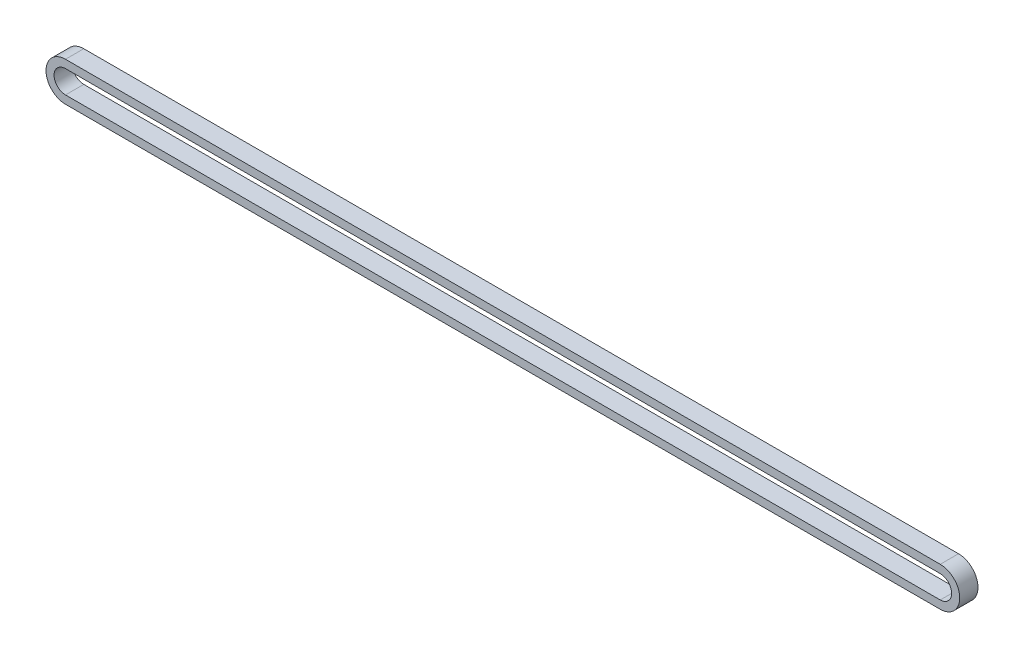
ISO-10303-21;
HEADER;
FILE_DESCRIPTION(('STEP AP214'),'2;1');
FILE_NAME('part.step','',(''),(''),'','','');
FILE_SCHEMA(('AUTOMOTIVE_DESIGN { 1 0 10303 214 1 1 1 1 }'));
ENDSEC;
DATA;
#1=APPLICATION_CONTEXT('core data for automotive mechanical design processes');
#2=APPLICATION_PROTOCOL_DEFINITION('international standard','automotive_design',2000,#1);
#3=PRODUCT_CONTEXT('',#1,'mechanical');
#4=PRODUCT('Part','Part','',(#3));
#5=PRODUCT_RELATED_PRODUCT_CATEGORY('part','',(#4));
#6=PRODUCT_DEFINITION_FORMATION('','',#4);
#7=PRODUCT_DEFINITION_CONTEXT('part definition',#1,'design');
#8=PRODUCT_DEFINITION('design','',#6,#7);
#9=PRODUCT_DEFINITION_SHAPE('','',#8);
#10=(LENGTH_UNIT() NAMED_UNIT(*) SI_UNIT(.MILLI.,.METRE.));
#11=(NAMED_UNIT(*) PLANE_ANGLE_UNIT() SI_UNIT($,.RADIAN.));
#12=(NAMED_UNIT(*) SI_UNIT($,.STERADIAN.) SOLID_ANGLE_UNIT());
#13=UNCERTAINTY_MEASURE_WITH_UNIT(LENGTH_MEASURE(1.E-05),#10,'distance_accuracy_value','');
#14=(GEOMETRIC_REPRESENTATION_CONTEXT(3) GLOBAL_UNCERTAINTY_ASSIGNED_CONTEXT((#13)) GLOBAL_UNIT_ASSIGNED_CONTEXT((#10,
#11,#12)) REPRESENTATION_CONTEXT('',''));
#15=CARTESIAN_POINT('',(0.,0.,0.));
#16=DIRECTION('',(0.,0.,1.));
#17=DIRECTION('',(1.,0.,0.));
#18=AXIS2_PLACEMENT_3D('',#15,#16,#17);
#19=CARTESIAN_POINT('',(0.,1.96023752785379E-13,3.));
#20=DIRECTION('',(0.,0.,1.));
#21=DIRECTION('',(1.,0.,0.));
#22=AXIS2_PLACEMENT_3D('',#19,#20,#21);
#23=PLANE('',#22);
#24=CARTESIAN_POINT('',(0.,1.96023752785379E-13,3.));
#25=DIRECTION('',(0.,0.,1.));
#26=DIRECTION('',(1.,0.,0.));
#27=AXIS2_PLACEMENT_3D('',#24,#25,#26);
#28=CIRCLE('',#27,3.2);
#29=CARTESIAN_POINT('',(0.,3.2000000000002,3.));
#30=VERTEX_POINT('',#29);
#31=CARTESIAN_POINT('',(0.,-3.1999999999998,3.));
#32=VERTEX_POINT('',#31);
#33=EDGE_CURVE('E140',#30,#32,#28,.T.);
#34=ORIENTED_EDGE('',*,*,#33,.T.);
#35=DIRECTION('',(1.,0.,0.));
#36=VECTOR('',#35,1.);
#37=CARTESIAN_POINT('',(0.,-3.1999999999998,3.));
#38=LINE('',#37,#36);
#39=CARTESIAN_POINT('',(143.6,-3.19999999999982,3.));
#40=VERTEX_POINT('',#39);
#41=EDGE_CURVE('E143',#32,#40,#38,.T.);
#42=ORIENTED_EDGE('',*,*,#41,.T.);
#43=CARTESIAN_POINT('',(143.6,1.92565121934025E-13,3.));
#44=DIRECTION('',(0.,0.,1.));
#45=DIRECTION('',(1.,0.,0.));
#46=AXIS2_PLACEMENT_3D('',#43,#44,#45);
#47=CIRCLE('',#46,3.20000000000001);
#48=CARTESIAN_POINT('',(143.6,3.2000000000002,3.));
#49=VERTEX_POINT('',#48);
#50=EDGE_CURVE('E146',#40,#49,#47,.T.);
#51=ORIENTED_EDGE('',*,*,#50,.T.);
#52=DIRECTION('',(-1.,0.,0.));
#53=VECTOR('',#52,1.);
#54=CARTESIAN_POINT('',(0.,3.2000000000002,3.));
#55=LINE('',#54,#53);
#56=EDGE_CURVE('E148',#49,#30,#55,.T.);
#57=ORIENTED_EDGE('',*,*,#56,.T.);
#58=EDGE_LOOP('',(#34,#42,#51,#57));
#59=FACE_BOUND('',#58,.T.);
#60=DIRECTION('',(1.,0.,0.));
#61=VECTOR('',#60,1.);
#62=CARTESIAN_POINT('',(0.,-1.8719999999998,3.));
#63=LINE('',#62,#61);
#64=CARTESIAN_POINT('',(0.,-1.8719999999998,3.));
#65=VERTEX_POINT('',#64);
#66=CARTESIAN_POINT('',(143.6,-1.87199999999981,3.));
#67=VERTEX_POINT('',#66);
#68=EDGE_CURVE('E112',#65,#67,#63,.T.);
#69=ORIENTED_EDGE('',*,*,#68,.F.);
#70=CARTESIAN_POINT('',(0.,1.96023752785379E-13,3.));
#71=DIRECTION('',(0.,0.,1.));
#72=DIRECTION('',(1.,0.,0.));
#73=AXIS2_PLACEMENT_3D('',#70,#71,#72);
#74=CIRCLE('',#73,1.872);
#75=CARTESIAN_POINT('',(0.,1.8720000000002,3.));
#76=VERTEX_POINT('',#75);
#77=EDGE_CURVE('E104',#76,#65,#74,.T.);
#78=ORIENTED_EDGE('',*,*,#77,.F.);
#79=DIRECTION('',(-1.,0.,0.));
#80=VECTOR('',#79,1.);
#81=CARTESIAN_POINT('',(0.,1.8720000000002,3.));
#82=LINE('',#81,#80);
#83=CARTESIAN_POINT('',(143.6,1.8720000000002,3.));
#84=VERTEX_POINT('',#83);
#85=EDGE_CURVE('E126',#84,#76,#82,.T.);
#86=ORIENTED_EDGE('',*,*,#85,.F.);
#87=CARTESIAN_POINT('',(143.6,1.92565121934025E-13,3.));
#88=DIRECTION('',(0.,0.,1.));
#89=DIRECTION('',(1.,0.,0.));
#90=AXIS2_PLACEMENT_3D('',#87,#88,#89);
#91=CIRCLE('',#90,1.87200000000001);
#92=EDGE_CURVE('E124',#67,#84,#91,.T.);
#93=ORIENTED_EDGE('',*,*,#92,.F.);
#94=EDGE_LOOP('',(#69,#78,#86,#93));
#95=FACE_BOUND('',#94,.T.);
#96=ADVANCED_FACE('F39',(#59,#95),#23,.T.);
#97=CARTESIAN_POINT('',(0.,1.96023752785379E-13,0.));
#98=DIRECTION('',(0.,0.,1.));
#99=DIRECTION('',(1.,0.,0.));
#100=AXIS2_PLACEMENT_3D('',#97,#98,#99);
#101=PLANE('',#100);
#102=CARTESIAN_POINT('',(0.,1.96023752785379E-13,0.));
#103=DIRECTION('',(0.,0.,1.));
#104=DIRECTION('',(1.,0.,0.));
#105=AXIS2_PLACEMENT_3D('',#102,#103,#104);
#106=CIRCLE('',#105,3.2);
#107=CARTESIAN_POINT('',(0.,3.2000000000002,0.));
#108=VERTEX_POINT('',#107);
#109=CARTESIAN_POINT('',(0.,-3.1999999999998,0.));
#110=VERTEX_POINT('',#109);
#111=EDGE_CURVE('E120',#108,#110,#106,.T.);
#112=ORIENTED_EDGE('',*,*,#111,.F.);
#113=DIRECTION('',(-1.,0.,0.));
#114=VECTOR('',#113,1.);
#115=CARTESIAN_POINT('',(0.,3.2000000000002,0.));
#116=LINE('',#115,#114);
#117=CARTESIAN_POINT('',(143.6,3.2000000000002,0.));
#118=VERTEX_POINT('',#117);
#119=EDGE_CURVE('E144',#118,#108,#116,.T.);
#120=ORIENTED_EDGE('',*,*,#119,.F.);
#121=CARTESIAN_POINT('',(143.6,1.92565121934025E-13,0.));
#122=DIRECTION('',(0.,0.,1.));
#123=DIRECTION('',(1.,0.,0.));
#124=AXIS2_PLACEMENT_3D('',#121,#122,#123);
#125=CIRCLE('',#124,3.20000000000001);
#126=CARTESIAN_POINT('',(143.6,-3.19999999999982,0.));
#127=VERTEX_POINT('',#126);
#128=EDGE_CURVE('E155',#127,#118,#125,.T.);
#129=ORIENTED_EDGE('',*,*,#128,.F.);
#130=DIRECTION('',(1.,0.,0.));
#131=VECTOR('',#130,1.);
#132=CARTESIAN_POINT('',(0.,-3.1999999999998,0.));
#133=LINE('',#132,#131);
#134=EDGE_CURVE('E153',#110,#127,#133,.T.);
#135=ORIENTED_EDGE('',*,*,#134,.F.);
#136=EDGE_LOOP('',(#112,#120,#129,#135));
#137=FACE_BOUND('',#136,.T.);
#138=CARTESIAN_POINT('',(0.,1.96023752785379E-13,0.));
#139=DIRECTION('',(0.,0.,1.));
#140=DIRECTION('',(1.,0.,0.));
#141=AXIS2_PLACEMENT_3D('',#138,#139,#140);
#142=CIRCLE('',#141,1.872);
#143=CARTESIAN_POINT('',(0.,1.8720000000002,0.));
#144=VERTEX_POINT('',#143);
#145=CARTESIAN_POINT('',(0.,-1.8719999999998,0.));
#146=VERTEX_POINT('',#145);
#147=EDGE_CURVE('E62',#144,#146,#142,.T.);
#148=ORIENTED_EDGE('',*,*,#147,.T.);
#149=DIRECTION('',(1.,0.,0.));
#150=VECTOR('',#149,1.);
#151=CARTESIAN_POINT('',(0.,-1.8719999999998,0.));
#152=LINE('',#151,#150);
#153=CARTESIAN_POINT('',(143.6,-1.87199999999981,0.));
#154=VERTEX_POINT('',#153);
#155=EDGE_CURVE('E119',#146,#154,#152,.T.);
#156=ORIENTED_EDGE('',*,*,#155,.T.);
#157=CARTESIAN_POINT('',(143.6,1.92565121934025E-13,0.));
#158=DIRECTION('',(0.,0.,1.));
#159=DIRECTION('',(1.,0.,0.));
#160=AXIS2_PLACEMENT_3D('',#157,#158,#159);
#161=CIRCLE('',#160,1.87200000000001);
#162=CARTESIAN_POINT('',(143.6,1.8720000000002,0.));
#163=VERTEX_POINT('',#162);
#164=EDGE_CURVE('E132',#154,#163,#161,.T.);
#165=ORIENTED_EDGE('',*,*,#164,.T.);
#166=DIRECTION('',(-1.,0.,0.));
#167=VECTOR('',#166,1.);
#168=CARTESIAN_POINT('',(0.,1.8720000000002,0.));
#169=LINE('',#168,#167);
#170=EDGE_CURVE('E113',#163,#144,#169,.T.);
#171=ORIENTED_EDGE('',*,*,#170,.T.);
#172=EDGE_LOOP('',(#148,#156,#165,#171));
#173=FACE_BOUND('',#172,.T.);
#174=ADVANCED_FACE('F173',(#137,#173),#101,.F.);
#175=CARTESIAN_POINT('',(0.,1.96023752785379E-13,3.));
#176=DIRECTION('',(0.,0.,-1.));
#177=DIRECTION('',(-1.,0.,0.));
#178=AXIS2_PLACEMENT_3D('',#175,#176,#177);
#179=CYLINDRICAL_SURFACE('',#178,3.2);
#180=ORIENTED_EDGE('',*,*,#111,.T.);
#181=DIRECTION('',(0.,0.,-1.));
#182=VECTOR('',#181,1.);
#183=CARTESIAN_POINT('',(0.,-3.1999999999998,3.));
#184=LINE('',#183,#182);
#185=EDGE_CURVE('E11',#32,#110,#184,.T.);
#186=ORIENTED_EDGE('',*,*,#185,.F.);
#187=ORIENTED_EDGE('',*,*,#33,.F.);
#188=DIRECTION('',(0.,0.,-1.));
#189=VECTOR('',#188,1.);
#190=CARTESIAN_POINT('',(0.,3.2000000000002,3.));
#191=LINE('',#190,#189);
#192=EDGE_CURVE('E150',#30,#108,#191,.T.);
#193=ORIENTED_EDGE('',*,*,#192,.T.);
#194=EDGE_LOOP('',(#180,#186,#187,#193));
#195=FACE_BOUND('',#194,.T.);
#196=ADVANCED_FACE('F41',(#195),#179,.T.);
#197=CARTESIAN_POINT('',(0.,-3.1999999999998,3.));
#198=DIRECTION('',(0.,1.,0.));
#199=DIRECTION('',(-1.,0.,0.));
#200=AXIS2_PLACEMENT_3D('',#197,#198,#199);
#201=PLANE('',#200);
#202=ORIENTED_EDGE('',*,*,#134,.T.);
#203=DIRECTION('',(0.,0.,-1.));
#204=VECTOR('',#203,1.);
#205=CARTESIAN_POINT('',(143.6,-3.19999999999982,3.));
#206=LINE('',#205,#204);
#207=EDGE_CURVE('E47',#40,#127,#206,.T.);
#208=ORIENTED_EDGE('',*,*,#207,.F.);
#209=ORIENTED_EDGE('',*,*,#41,.F.);
#210=ORIENTED_EDGE('',*,*,#185,.T.);
#211=EDGE_LOOP('',(#202,#208,#209,#210));
#212=FACE_BOUND('',#211,.T.);
#213=ADVANCED_FACE('F183',(#212),#201,.F.);
#214=CARTESIAN_POINT('',(143.6,1.92565121934025E-13,3.));
#215=DIRECTION('',(0.,0.,-1.));
#216=DIRECTION('',(-1.,0.,0.));
#217=AXIS2_PLACEMENT_3D('',#214,#215,#216);
#218=CYLINDRICAL_SURFACE('',#217,3.20000000000001);
#219=ORIENTED_EDGE('',*,*,#128,.T.);
#220=DIRECTION('',(0.,0.,-1.));
#221=VECTOR('',#220,1.);
#222=CARTESIAN_POINT('',(143.6,3.2000000000002,3.));
#223=LINE('',#222,#221);
#224=EDGE_CURVE('E160',#49,#118,#223,.T.);
#225=ORIENTED_EDGE('',*,*,#224,.F.);
#226=ORIENTED_EDGE('',*,*,#50,.F.);
#227=ORIENTED_EDGE('',*,*,#207,.T.);
#228=EDGE_LOOP('',(#219,#225,#226,#227));
#229=FACE_BOUND('',#228,.T.);
#230=ADVANCED_FACE('F167',(#229),#218,.T.);
#231=CARTESIAN_POINT('',(0.,3.2000000000002,3.));
#232=DIRECTION('',(0.,-1.,0.));
#233=DIRECTION('',(1.,0.,0.));
#234=AXIS2_PLACEMENT_3D('',#231,#232,#233);
#235=PLANE('',#234);
#236=ORIENTED_EDGE('',*,*,#119,.T.);
#237=ORIENTED_EDGE('',*,*,#192,.F.);
#238=ORIENTED_EDGE('',*,*,#56,.F.);
#239=ORIENTED_EDGE('',*,*,#224,.T.);
#240=EDGE_LOOP('',(#236,#237,#238,#239));
#241=FACE_BOUND('',#240,.T.);
#242=ADVANCED_FACE('F177',(#241),#235,.F.);
#243=CARTESIAN_POINT('',(0.,1.96023752785379E-13,3.));
#244=DIRECTION('',(0.,0.,-1.));
#245=DIRECTION('',(-1.,0.,0.));
#246=AXIS2_PLACEMENT_3D('',#243,#244,#245);
#247=CYLINDRICAL_SURFACE('',#246,1.872);
#248=ORIENTED_EDGE('',*,*,#147,.F.);
#249=DIRECTION('',(0.,0.,-1.));
#250=VECTOR('',#249,1.);
#251=CARTESIAN_POINT('',(0.,1.8720000000002,3.));
#252=LINE('',#251,#250);
#253=EDGE_CURVE('E108',#76,#144,#252,.T.);
#254=ORIENTED_EDGE('',*,*,#253,.F.);
#255=ORIENTED_EDGE('',*,*,#77,.T.);
#256=DIRECTION('',(0.,0.,-1.));
#257=VECTOR('',#256,1.);
#258=CARTESIAN_POINT('',(0.,-1.8719999999998,3.));
#259=LINE('',#258,#257);
#260=EDGE_CURVE('E107',#65,#146,#259,.T.);
#261=ORIENTED_EDGE('',*,*,#260,.T.);
#262=EDGE_LOOP('',(#248,#254,#255,#261));
#263=FACE_BOUND('',#262,.T.);
#264=ADVANCED_FACE('F106',(#263),#247,.F.);
#265=CARTESIAN_POINT('',(0.,-1.8719999999998,3.));
#266=DIRECTION('',(0.,1.,0.));
#267=DIRECTION('',(-1.,0.,0.));
#268=AXIS2_PLACEMENT_3D('',#265,#266,#267);
#269=PLANE('',#268);
#270=ORIENTED_EDGE('',*,*,#155,.F.);
#271=ORIENTED_EDGE('',*,*,#260,.F.);
#272=ORIENTED_EDGE('',*,*,#68,.T.);
#273=DIRECTION('',(0.,0.,-1.));
#274=VECTOR('',#273,1.);
#275=CARTESIAN_POINT('',(143.6,-1.87199999999981,3.));
#276=LINE('',#275,#274);
#277=EDGE_CURVE('E121',#67,#154,#276,.T.);
#278=ORIENTED_EDGE('',*,*,#277,.T.);
#279=EDGE_LOOP('',(#270,#271,#272,#278));
#280=FACE_BOUND('',#279,.T.);
#281=ADVANCED_FACE('F116',(#280),#269,.T.);
#282=CARTESIAN_POINT('',(143.6,1.92565121934025E-13,3.));
#283=DIRECTION('',(0.,0.,-1.));
#284=DIRECTION('',(-1.,0.,0.));
#285=AXIS2_PLACEMENT_3D('',#282,#283,#284);
#286=CYLINDRICAL_SURFACE('',#285,1.87200000000001);
#287=ORIENTED_EDGE('',*,*,#164,.F.);
#288=ORIENTED_EDGE('',*,*,#277,.F.);
#289=ORIENTED_EDGE('',*,*,#92,.T.);
#290=DIRECTION('',(0.,0.,-1.));
#291=VECTOR('',#290,1.);
#292=CARTESIAN_POINT('',(143.6,1.8720000000002,3.));
#293=LINE('',#292,#291);
#294=EDGE_CURVE('E54',#84,#163,#293,.T.);
#295=ORIENTED_EDGE('',*,*,#294,.T.);
#296=EDGE_LOOP('',(#287,#288,#289,#295));
#297=FACE_BOUND('',#296,.T.);
#298=ADVANCED_FACE('F206',(#297),#286,.F.);
#299=CARTESIAN_POINT('',(0.,1.8720000000002,3.));
#300=DIRECTION('',(0.,-1.,0.));
#301=DIRECTION('',(1.,0.,0.));
#302=AXIS2_PLACEMENT_3D('',#299,#300,#301);
#303=PLANE('',#302);
#304=ORIENTED_EDGE('',*,*,#170,.F.);
#305=ORIENTED_EDGE('',*,*,#294,.F.);
#306=ORIENTED_EDGE('',*,*,#85,.T.);
#307=ORIENTED_EDGE('',*,*,#253,.T.);
#308=EDGE_LOOP('',(#304,#305,#306,#307));
#309=FACE_BOUND('',#308,.T.);
#310=ADVANCED_FACE('F210',(#309),#303,.T.);
#311=CLOSED_SHELL('',(#96,#174,#196,#213,#230,#242,#264,#281,#298,#310));
#312=MANIFOLD_SOLID_BREP('B2',#311);
#313=ADVANCED_BREP_SHAPE_REPRESENTATION('',(#18,#312),#14);
#314=SHAPE_DEFINITION_REPRESENTATION(#9,#313);
ENDSEC;
END-ISO-10303-21;
